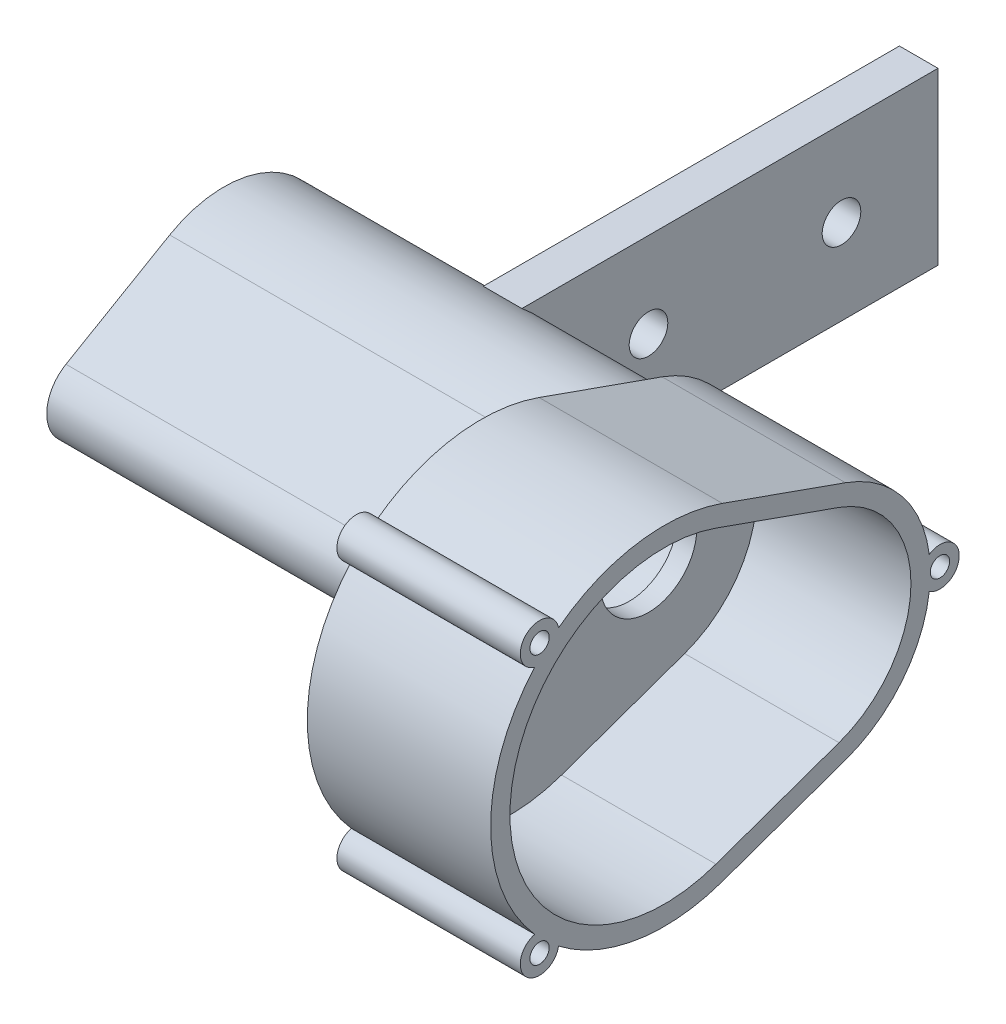
ISO-10303-21;
HEADER;
FILE_DESCRIPTION(('STEP AP214'),'2;1');
FILE_NAME('part.step','',(''),(''),'','','');
FILE_SCHEMA(('AUTOMOTIVE_DESIGN { 1 0 10303 214 1 1 1 1 }'));
ENDSEC;
DATA;
#1=APPLICATION_CONTEXT('core data for automotive mechanical design processes');
#2=APPLICATION_PROTOCOL_DEFINITION('international standard','automotive_design',2000,#1);
#3=PRODUCT_CONTEXT('',#1,'mechanical');
#4=PRODUCT('Part','Part','',(#3));
#5=PRODUCT_RELATED_PRODUCT_CATEGORY('part','',(#4));
#6=PRODUCT_DEFINITION_FORMATION('','',#4);
#7=PRODUCT_DEFINITION_CONTEXT('part definition',#1,'design');
#8=PRODUCT_DEFINITION('design','',#6,#7);
#9=PRODUCT_DEFINITION_SHAPE('','',#8);
#10=(LENGTH_UNIT() NAMED_UNIT(*) SI_UNIT(.MILLI.,.METRE.));
#11=(NAMED_UNIT(*) PLANE_ANGLE_UNIT() SI_UNIT($,.RADIAN.));
#12=(NAMED_UNIT(*) SI_UNIT($,.STERADIAN.) SOLID_ANGLE_UNIT());
#13=UNCERTAINTY_MEASURE_WITH_UNIT(LENGTH_MEASURE(1.E-05),#10,'distance_accuracy_value','');
#14=(GEOMETRIC_REPRESENTATION_CONTEXT(3) GLOBAL_UNCERTAINTY_ASSIGNED_CONTEXT((#13)) GLOBAL_UNIT_ASSIGNED_CONTEXT((#10,
#11,#12)) REPRESENTATION_CONTEXT('',''));
#15=CARTESIAN_POINT('',(0.,0.,0.));
#16=DIRECTION('',(0.,0.,1.));
#17=DIRECTION('',(1.,0.,0.));
#18=AXIS2_PLACEMENT_3D('',#15,#16,#17);
#19=CARTESIAN_POINT('',(22.,0.,0.));
#20=DIRECTION('',(-1.,0.,0.));
#21=DIRECTION('',(0.,0.,1.));
#22=AXIS2_PLACEMENT_3D('',#19,#20,#21);
#23=CYLINDRICAL_SURFACE('',#22,4.1);
#24=CARTESIAN_POINT('',(0.,0.,0.));
#25=DIRECTION('',(1.,0.,0.));
#26=DIRECTION('',(0.,0.,-1.));
#27=AXIS2_PLACEMENT_3D('',#24,#25,#26);
#28=CIRCLE('',#27,4.1);
#29=CARTESIAN_POINT('',(0.,0.,-4.1));
#30=VERTEX_POINT('',#29);
#31=EDGE_CURVE('E298',#30,#30,#28,.T.);
#32=ORIENTED_EDGE('',*,*,#31,.F.);
#33=EDGE_LOOP('',(#32));
#34=FACE_BOUND('',#33,.T.);
#35=CARTESIAN_POINT('',(21.,0.,0.));
#36=DIRECTION('',(1.,0.,0.));
#37=DIRECTION('',(0.,0.,-1.));
#38=AXIS2_PLACEMENT_3D('',#35,#36,#37);
#39=CIRCLE('',#38,4.1);
#40=CARTESIAN_POINT('',(21.,0.,-4.1));
#41=VERTEX_POINT('',#40);
#42=EDGE_CURVE('E248',#41,#41,#39,.F.);
#43=ORIENTED_EDGE('',*,*,#42,.F.);
#44=EDGE_LOOP('',(#43));
#45=FACE_BOUND('',#44,.T.);
#46=ADVANCED_FACE('F36',(#34,#45),#23,.F.);
#47=CARTESIAN_POINT('',(22.,0.,0.));
#48=DIRECTION('',(-1.,0.,0.));
#49=DIRECTION('',(0.,0.,1.));
#50=AXIS2_PLACEMENT_3D('',#47,#48,#49);
#51=CYLINDRICAL_SURFACE('',#50,5.6);
#52=DIRECTION('',(-1.,0.,0.));
#53=VECTOR('',#52,1.);
#54=CARTESIAN_POINT('',(22.,4.4192376757751,-3.43952589247558));
#55=LINE('',#54,#53);
#56=CARTESIAN_POINT('',(12.,4.41923767577509,-3.43952589247559));
#57=VERTEX_POINT('',#56);
#58=CARTESIAN_POINT('',(10.,4.41923767577509,-3.43952589247558));
#59=VERTEX_POINT('',#58);
#60=EDGE_CURVE('E326',#57,#59,#55,.T.);
#61=ORIENTED_EDGE('',*,*,#60,.T.);
#62=CARTESIAN_POINT('',(10.,0.,0.));
#63=DIRECTION('',(-1.,0.,0.));
#64=DIRECTION('',(0.,0.,1.));
#65=AXIS2_PLACEMENT_3D('',#62,#63,#64);
#66=CIRCLE('',#65,5.6);
#67=CARTESIAN_POINT('',(10.,-4.41923767577509,-3.43952589247559));
#68=VERTEX_POINT('',#67);
#69=EDGE_CURVE('E291',#59,#68,#66,.T.);
#70=ORIENTED_EDGE('',*,*,#69,.T.);
#71=DIRECTION('',(-1.,0.,0.));
#72=VECTOR('',#71,1.);
#73=CARTESIAN_POINT('',(22.,-4.41923767577509,-3.43952589247558));
#74=LINE('',#73,#72);
#75=CARTESIAN_POINT('',(12.,-4.41923767577509,-3.43952589247558));
#76=VERTEX_POINT('',#75);
#77=EDGE_CURVE('E323',#68,#76,#74,.F.);
#78=ORIENTED_EDGE('',*,*,#77,.T.);
#79=CARTESIAN_POINT('',(12.,0.,0.));
#80=DIRECTION('',(1.,0.,0.));
#81=DIRECTION('',(0.,0.,-1.));
#82=AXIS2_PLACEMENT_3D('',#79,#80,#81);
#83=CIRCLE('',#82,5.6);
#84=EDGE_CURVE('E281',#76,#57,#83,.T.);
#85=ORIENTED_EDGE('',*,*,#84,.T.);
#86=EDGE_LOOP('',(#61,#70,#78,#85));
#87=FACE_BOUND('',#86,.T.);
#88=DIRECTION('',(-1.,0.,0.));
#89=VECTOR('',#88,1.);
#90=CARTESIAN_POINT('',(22.,4.84523088082164,2.80779944289693));
#91=LINE('',#90,#89);
#92=CARTESIAN_POINT('',(20.5,4.84523088082164,2.80779944289693));
#93=VERTEX_POINT('',#92);
#94=CARTESIAN_POINT('',(0.,4.84523088082164,2.80779944289693));
#95=VERTEX_POINT('',#94);
#96=EDGE_CURVE('E317',#93,#95,#91,.T.);
#97=ORIENTED_EDGE('',*,*,#96,.F.);
#98=CARTESIAN_POINT('',(20.5,0.,0.));
#99=DIRECTION('',(1.,0.,0.));
#100=DIRECTION('',(0.,0.,-1.));
#101=AXIS2_PLACEMENT_3D('',#98,#99,#100);
#102=CIRCLE('',#101,5.6);
#103=CARTESIAN_POINT('',(20.5,-4.93426082210925,2.64822018333026));
#104=VERTEX_POINT('',#103);
#105=EDGE_CURVE('E332',#104,#93,#102,.T.);
#106=ORIENTED_EDGE('',*,*,#105,.F.);
#107=DIRECTION('',(-1.,0.,0.));
#108=VECTOR('',#107,1.);
#109=CARTESIAN_POINT('',(22.,-4.93426082210925,2.64822018333026));
#110=LINE('',#109,#108);
#111=CARTESIAN_POINT('',(0.,-4.93426082210925,2.64822018333026));
#112=VERTEX_POINT('',#111);
#113=EDGE_CURVE('E319',#104,#112,#110,.T.);
#114=ORIENTED_EDGE('',*,*,#113,.T.);
#115=CARTESIAN_POINT('',(0.,0.,0.));
#116=DIRECTION('',(1.,0.,0.));
#117=DIRECTION('',(0.,0.,-1.));
#118=AXIS2_PLACEMENT_3D('',#115,#116,#117);
#119=CIRCLE('',#118,5.6);
#120=EDGE_CURVE('E309',#112,#95,#119,.T.);
#121=ORIENTED_EDGE('',*,*,#120,.T.);
#122=EDGE_LOOP('',(#97,#106,#114,#121));
#123=FACE_BOUND('',#122,.T.);
#124=ADVANCED_FACE('F417',(#87,#123),#51,.T.);
#125=CARTESIAN_POINT('',(22.,0.,7.18));
#126=DIRECTION('',(-1.,0.,0.));
#127=DIRECTION('',(0.,0.,1.));
#128=AXIS2_PLACEMENT_3D('',#125,#126,#127);
#129=CYLINDRICAL_SURFACE('',#128,2.);
#130=DIRECTION('',(-1.,0.,0.));
#131=VECTOR('',#130,1.);
#132=CARTESIAN_POINT('',(22.,-1.73090695637433,8.1819785967649));
#133=LINE('',#132,#131);
#134=CARTESIAN_POINT('',(20.5,-1.73090695637433,8.1819785967649));
#135=VERTEX_POINT('',#134);
#136=CARTESIAN_POINT('',(0.,-1.73090695637433,8.1819785967649));
#137=VERTEX_POINT('',#136);
#138=EDGE_CURVE('E321',#135,#137,#133,.T.);
#139=ORIENTED_EDGE('',*,*,#138,.F.);
#140=CARTESIAN_POINT('',(20.5,0.,7.18));
#141=DIRECTION('',(1.,0.,0.));
#142=DIRECTION('',(0.,0.,-1.));
#143=AXIS2_PLACEMENT_3D('',#140,#141,#142);
#144=CIRCLE('',#143,2.);
#145=CARTESIAN_POINT('',(20.5,1.73043960029344,8.18278551532033));
#146=VERTEX_POINT('',#145);
#147=EDGE_CURVE('E337',#146,#135,#144,.T.);
#148=ORIENTED_EDGE('',*,*,#147,.F.);
#149=DIRECTION('',(-1.,0.,0.));
#150=VECTOR('',#149,1.);
#151=CARTESIAN_POINT('',(22.,1.73043960029344,8.18278551532033));
#152=LINE('',#151,#150);
#153=CARTESIAN_POINT('',(0.,1.73043960029344,8.18278551532033));
#154=VERTEX_POINT('',#153);
#155=EDGE_CURVE('E315',#146,#154,#152,.T.);
#156=ORIENTED_EDGE('',*,*,#155,.T.);
#157=CARTESIAN_POINT('',(0.,0.,7.18));
#158=DIRECTION('',(1.,0.,0.));
#159=DIRECTION('',(0.,0.,-1.));
#160=AXIS2_PLACEMENT_3D('',#157,#158,#159);
#161=CIRCLE('',#160,2.);
#162=EDGE_CURVE('E303',#154,#137,#161,.T.);
#163=ORIENTED_EDGE('',*,*,#162,.T.);
#164=EDGE_LOOP('',(#139,#148,#156,#163));
#165=FACE_BOUND('',#164,.T.);
#166=ADVANCED_FACE('F423',(#165),#129,.T.);
#167=CARTESIAN_POINT('',(22.,-4.93426082210925,2.64822018333026));
#168=DIRECTION('',(0.,0.865453478187166,-0.500989298382448));
#169=DIRECTION('',(0.,0.500989298382448,0.865453478187166));
#170=AXIS2_PLACEMENT_3D('',#167,#168,#169);
#171=PLANE('',#170);
#172=ORIENTED_EDGE('',*,*,#113,.F.);
#173=DIRECTION('',(0.,-0.500989298382448,-0.865453478187165));
#174=VECTOR('',#173,1.);
#175=CARTESIAN_POINT('',(20.5,-4.84403239965933,2.80408878629793));
#176=LINE('',#175,#174);
#177=EDGE_CURVE('E334',#135,#104,#176,.T.);
#178=ORIENTED_EDGE('',*,*,#177,.F.);
#179=ORIENTED_EDGE('',*,*,#138,.T.);
#180=DIRECTION('',(0.,-0.500989298382448,-0.865453478187165));
#181=VECTOR('',#180,1.);
#182=CARTESIAN_POINT('',(0.,-4.93426082210925,2.64822018333026));
#183=LINE('',#182,#181);
#184=EDGE_CURVE('E306',#137,#112,#183,.T.);
#185=ORIENTED_EDGE('',*,*,#184,.T.);
#186=EDGE_LOOP('',(#172,#178,#179,#185));
#187=FACE_BOUND('',#186,.T.);
#188=ADVANCED_FACE('F438',(#187),#171,.F.);
#189=CARTESIAN_POINT('',(22.,4.84523088082164,2.80779944289693));
#190=DIRECTION('',(0.,-0.865219800146722,-0.501392757660167));
#191=DIRECTION('',(0.,0.501392757660167,-0.865219800146722));
#192=AXIS2_PLACEMENT_3D('',#189,#190,#191);
#193=PLANE('',#192);
#194=ORIENTED_EDGE('',*,*,#155,.F.);
#195=DIRECTION('',(0.,-0.501392757660167,0.865219800146722));
#196=VECTOR('',#195,1.);
#197=CARTESIAN_POINT('',(20.5,4.84523088082164,2.80779944289693));
#198=LINE('',#197,#196);
#199=EDGE_CURVE('E329',#93,#146,#198,.T.);
#200=ORIENTED_EDGE('',*,*,#199,.F.);
#201=ORIENTED_EDGE('',*,*,#96,.T.);
#202=DIRECTION('',(0.,-0.501392757660167,0.865219800146722));
#203=VECTOR('',#202,1.);
#204=CARTESIAN_POINT('',(0.,4.84523088082164,2.80779944289693));
#205=LINE('',#204,#203);
#206=EDGE_CURVE('E312',#95,#154,#205,.T.);
#207=ORIENTED_EDGE('',*,*,#206,.T.);
#208=EDGE_LOOP('',(#194,#200,#201,#207));
#209=FACE_BOUND('',#208,.T.);
#210=ADVANCED_FACE('F435',(#209),#193,.F.);
#211=CARTESIAN_POINT('',(0.,0.,7.18));
#212=DIRECTION('',(1.,0.,0.));
#213=DIRECTION('',(0.,0.,-1.));
#214=AXIS2_PLACEMENT_3D('',#211,#212,#213);
#215=PLANE('',#214);
#216=ORIENTED_EDGE('',*,*,#162,.F.);
#217=ORIENTED_EDGE('',*,*,#206,.F.);
#218=ORIENTED_EDGE('',*,*,#120,.F.);
#219=ORIENTED_EDGE('',*,*,#184,.F.);
#220=EDGE_LOOP('',(#216,#217,#218,#219));
#221=FACE_BOUND('',#220,.T.);
#222=ORIENTED_EDGE('',*,*,#31,.T.);
#223=EDGE_LOOP('',(#222));
#224=FACE_BOUND('',#223,.T.);
#225=CARTESIAN_POINT('',(0.,0.,7.18));
#226=DIRECTION('',(1.,0.,0.));
#227=DIRECTION('',(0.,0.,-1.));
#228=AXIS2_PLACEMENT_3D('',#225,#226,#227);
#229=CIRCLE('',#228,0.749999999999998);
#230=CARTESIAN_POINT('',(0.,0.,6.43));
#231=VERTEX_POINT('',#230);
#232=EDGE_CURVE('E294',#231,#231,#229,.T.);
#233=ORIENTED_EDGE('',*,*,#232,.T.);
#234=EDGE_LOOP('',(#233));
#235=FACE_BOUND('',#234,.T.);
#236=ADVANCED_FACE('F432',(#221,#224,#235),#215,.F.);
#237=CARTESIAN_POINT('',(22.,0.,7.18));
#238=DIRECTION('',(-1.,0.,0.));
#239=DIRECTION('',(0.,0.,1.));
#240=AXIS2_PLACEMENT_3D('',#237,#238,#239);
#241=CYLINDRICAL_SURFACE('',#240,0.749999999999998);
#242=CARTESIAN_POINT('',(22.,0.,7.18));
#243=DIRECTION('',(1.,0.,0.));
#244=DIRECTION('',(0.,0.,-1.));
#245=AXIS2_PLACEMENT_3D('',#242,#243,#244);
#246=CIRCLE('',#245,0.749999999999998);
#247=CARTESIAN_POINT('',(22.,0.,6.43));
#248=VERTEX_POINT('',#247);
#249=EDGE_CURVE('E295',#248,#248,#246,.T.);
#250=ORIENTED_EDGE('',*,*,#249,.T.);
#251=EDGE_LOOP('',(#250));
#252=FACE_BOUND('',#251,.T.);
#253=ORIENTED_EDGE('',*,*,#232,.F.);
#254=EDGE_LOOP('',(#253));
#255=FACE_BOUND('',#254,.T.);
#256=ADVANCED_FACE('F430',(#252,#255),#241,.F.);
#257=CARTESIAN_POINT('',(12.,4.41923767577509,-25.));
#258=DIRECTION('',(0.,1.,0.));
#259=DIRECTION('',(-1.,0.,0.));
#260=AXIS2_PLACEMENT_3D('',#257,#258,#259);
#261=PLANE('',#260);
#262=ORIENTED_EDGE('',*,*,#60,.F.);
#263=DIRECTION('',(0.,0.,1.));
#264=VECTOR('',#263,1.);
#265=CARTESIAN_POINT('',(12.,4.41923767577509,-25.));
#266=LINE('',#265,#264);
#267=CARTESIAN_POINT('',(12.,4.41923767577509,-25.));
#268=VERTEX_POINT('',#267);
#269=EDGE_CURVE('E282',#268,#57,#266,.T.);
#270=ORIENTED_EDGE('',*,*,#269,.F.);
#271=DIRECTION('',(-1.,0.,0.));
#272=VECTOR('',#271,1.);
#273=CARTESIAN_POINT('',(12.,4.41923767577509,-25.));
#274=LINE('',#273,#272);
#275=CARTESIAN_POINT('',(10.,4.41923767577509,-25.));
#276=VERTEX_POINT('',#275);
#277=EDGE_CURVE('E274',#268,#276,#274,.T.);
#278=ORIENTED_EDGE('',*,*,#277,.T.);
#279=DIRECTION('',(0.,0.,1.));
#280=VECTOR('',#279,1.);
#281=CARTESIAN_POINT('',(10.,4.41923767577509,-25.));
#282=LINE('',#281,#280);
#283=EDGE_CURVE('E278',#276,#59,#282,.T.);
#284=ORIENTED_EDGE('',*,*,#283,.T.);
#285=EDGE_LOOP('',(#262,#270,#278,#284));
#286=FACE_BOUND('',#285,.T.);
#287=ADVANCED_FACE('F678',(#286),#261,.T.);
#288=CARTESIAN_POINT('',(12.,-4.41923767577509,-25.));
#289=DIRECTION('',(0.,-1.,0.));
#290=DIRECTION('',(0.,0.,-1.));
#291=AXIS2_PLACEMENT_3D('',#288,#289,#290);
#292=PLANE('',#291);
#293=ORIENTED_EDGE('',*,*,#77,.F.);
#294=DIRECTION('',(0.,0.,1.));
#295=VECTOR('',#294,1.);
#296=CARTESIAN_POINT('',(10.,-4.41923767577509,-25.));
#297=LINE('',#296,#295);
#298=CARTESIAN_POINT('',(10.,-4.41923767577509,-25.));
#299=VERTEX_POINT('',#298);
#300=EDGE_CURVE('E277',#299,#68,#297,.T.);
#301=ORIENTED_EDGE('',*,*,#300,.F.);
#302=DIRECTION('',(1.,0.,0.));
#303=VECTOR('',#302,1.);
#304=CARTESIAN_POINT('',(12.,-4.41923767577509,-25.));
#305=LINE('',#304,#303);
#306=CARTESIAN_POINT('',(12.,-4.41923767577509,-25.));
#307=VERTEX_POINT('',#306);
#308=EDGE_CURVE('E268',#299,#307,#305,.T.);
#309=ORIENTED_EDGE('',*,*,#308,.T.);
#310=DIRECTION('',(0.,0.,1.));
#311=VECTOR('',#310,1.);
#312=CARTESIAN_POINT('',(12.,-4.41923767577509,-25.));
#313=LINE('',#312,#311);
#314=EDGE_CURVE('E285',#307,#76,#313,.T.);
#315=ORIENTED_EDGE('',*,*,#314,.T.);
#316=EDGE_LOOP('',(#293,#301,#309,#315));
#317=FACE_BOUND('',#316,.T.);
#318=ADVANCED_FACE('F687',(#317),#292,.T.);
#319=CARTESIAN_POINT('',(10.,-4.41923767577509,-25.));
#320=DIRECTION('',(-1.,0.,0.));
#321=DIRECTION('',(0.,0.,1.));
#322=AXIS2_PLACEMENT_3D('',#319,#320,#321);
#323=PLANE('',#322);
#324=CARTESIAN_POINT('',(10.,0.,-20.));
#325=DIRECTION('',(-1.,0.,0.));
#326=DIRECTION('',(0.,0.,1.));
#327=AXIS2_PLACEMENT_3D('',#324,#325,#326);
#328=CIRCLE('',#327,1.);
#329=CARTESIAN_POINT('',(10.,0.,-19.));
#330=VERTEX_POINT('',#329);
#331=EDGE_CURVE('E262',#330,#330,#328,.T.);
#332=ORIENTED_EDGE('',*,*,#331,.F.);
#333=EDGE_LOOP('',(#332));
#334=FACE_BOUND('',#333,.T.);
#335=CARTESIAN_POINT('',(10.,0.,-10.));
#336=DIRECTION('',(-1.,0.,0.));
#337=DIRECTION('',(0.,0.,1.));
#338=AXIS2_PLACEMENT_3D('',#335,#336,#337);
#339=CIRCLE('',#338,1.);
#340=CARTESIAN_POINT('',(10.,0.,-9.));
#341=VERTEX_POINT('',#340);
#342=EDGE_CURVE('E257',#341,#341,#339,.T.);
#343=ORIENTED_EDGE('',*,*,#342,.F.);
#344=EDGE_LOOP('',(#343));
#345=FACE_BOUND('',#344,.T.);
#346=ORIENTED_EDGE('',*,*,#69,.F.);
#347=ORIENTED_EDGE('',*,*,#283,.F.);
#348=DIRECTION('',(0.,-1.,0.));
#349=VECTOR('',#348,1.);
#350=CARTESIAN_POINT('',(10.,-4.41923767577509,-25.));
#351=LINE('',#350,#349);
#352=EDGE_CURVE('E265',#276,#299,#351,.T.);
#353=ORIENTED_EDGE('',*,*,#352,.T.);
#354=ORIENTED_EDGE('',*,*,#300,.T.);
#355=EDGE_LOOP('',(#346,#347,#353,#354));
#356=FACE_BOUND('',#355,.T.);
#357=ADVANCED_FACE('F697',(#334,#345,#356),#323,.T.);
#358=CARTESIAN_POINT('',(12.,-4.41923767577509,-25.));
#359=DIRECTION('',(1.,0.,0.));
#360=DIRECTION('',(0.,0.,-1.));
#361=AXIS2_PLACEMENT_3D('',#358,#359,#360);
#362=PLANE('',#361);
#363=CARTESIAN_POINT('',(12.,0.,-20.));
#364=DIRECTION('',(1.,0.,0.));
#365=DIRECTION('',(0.,0.,-1.));
#366=AXIS2_PLACEMENT_3D('',#363,#364,#365);
#367=CIRCLE('',#366,1.);
#368=CARTESIAN_POINT('',(12.,0.,-21.));
#369=VERTEX_POINT('',#368);
#370=EDGE_CURVE('E254',#369,#369,#367,.T.);
#371=ORIENTED_EDGE('',*,*,#370,.F.);
#372=EDGE_LOOP('',(#371));
#373=FACE_BOUND('',#372,.T.);
#374=CARTESIAN_POINT('',(12.,0.,-10.));
#375=DIRECTION('',(1.,0.,0.));
#376=DIRECTION('',(0.,0.,-1.));
#377=AXIS2_PLACEMENT_3D('',#374,#375,#376);
#378=CIRCLE('',#377,1.);
#379=CARTESIAN_POINT('',(12.,0.,-11.));
#380=VERTEX_POINT('',#379);
#381=EDGE_CURVE('E252',#380,#380,#378,.T.);
#382=ORIENTED_EDGE('',*,*,#381,.F.);
#383=EDGE_LOOP('',(#382));
#384=FACE_BOUND('',#383,.T.);
#385=ORIENTED_EDGE('',*,*,#84,.F.);
#386=ORIENTED_EDGE('',*,*,#314,.F.);
#387=DIRECTION('',(0.,1.,0.));
#388=VECTOR('',#387,1.);
#389=CARTESIAN_POINT('',(12.,-4.41923767577509,-25.));
#390=LINE('',#389,#388);
#391=EDGE_CURVE('E271',#307,#268,#390,.T.);
#392=ORIENTED_EDGE('',*,*,#391,.T.);
#393=ORIENTED_EDGE('',*,*,#269,.T.);
#394=EDGE_LOOP('',(#385,#386,#392,#393));
#395=FACE_BOUND('',#394,.T.);
#396=ADVANCED_FACE('F707',(#373,#384,#395),#362,.T.);
#397=CARTESIAN_POINT('',(0.,0.,-25.));
#398=DIRECTION('',(0.,0.,1.));
#399=DIRECTION('',(1.,0.,0.));
#400=AXIS2_PLACEMENT_3D('',#397,#398,#399);
#401=PLANE('',#400);
#402=ORIENTED_EDGE('',*,*,#352,.F.);
#403=ORIENTED_EDGE('',*,*,#277,.F.);
#404=ORIENTED_EDGE('',*,*,#391,.F.);
#405=ORIENTED_EDGE('',*,*,#308,.F.);
#406=EDGE_LOOP('',(#402,#403,#404,#405));
#407=FACE_BOUND('',#406,.T.);
#408=ADVANCED_FACE('F716',(#407),#401,.F.);
#409=CARTESIAN_POINT('',(0.,0.,-10.));
#410=DIRECTION('',(1.,0.,0.));
#411=DIRECTION('',(0.,0.,-1.));
#412=AXIS2_PLACEMENT_3D('',#409,#410,#411);
#413=CYLINDRICAL_SURFACE('',#412,1.);
#414=ORIENTED_EDGE('',*,*,#342,.T.);
#415=EDGE_LOOP('',(#414));
#416=FACE_BOUND('',#415,.T.);
#417=ORIENTED_EDGE('',*,*,#381,.T.);
#418=EDGE_LOOP('',(#417));
#419=FACE_BOUND('',#418,.T.);
#420=ADVANCED_FACE('F726',(#416,#419),#413,.F.);
#421=CARTESIAN_POINT('',(0.,0.,-20.));
#422=DIRECTION('',(1.,0.,0.));
#423=DIRECTION('',(0.,0.,-1.));
#424=AXIS2_PLACEMENT_3D('',#421,#422,#423);
#425=CYLINDRICAL_SURFACE('',#424,1.);
#426=ORIENTED_EDGE('',*,*,#331,.T.);
#427=EDGE_LOOP('',(#426));
#428=FACE_BOUND('',#427,.T.);
#429=ORIENTED_EDGE('',*,*,#370,.T.);
#430=EDGE_LOOP('',(#429));
#431=FACE_BOUND('',#430,.T.);
#432=ADVANCED_FACE('F413',(#428,#431),#425,.F.);
#433=CARTESIAN_POINT('',(20.5,0.,7.18));
#434=DIRECTION('',(1.,0.,0.));
#435=DIRECTION('',(0.,0.,-1.));
#436=AXIS2_PLACEMENT_3D('',#433,#434,#435);
#437=CYLINDRICAL_SURFACE('',#436,8.);
#438=CARTESIAN_POINT('',(22.,0.,7.18));
#439=DIRECTION('',(1.,0.,0.));
#440=DIRECTION('',(0.,0.,-1.));
#441=AXIS2_PLACEMENT_3D('',#438,#439,#440);
#442=CIRCLE('',#441,8.);
#443=CARTESIAN_POINT('',(22.,7.53984200731082,4.50590529247911));
#444=VERTEX_POINT('',#443);
#445=CARTESIAN_POINT('',(22.,-7.53984200731082,4.50590529247911));
#446=VERTEX_POINT('',#445);
#447=EDGE_CURVE('E44',#444,#446,#442,.T.);
#448=ORIENTED_EDGE('',*,*,#447,.F.);
#449=DIRECTION('',(1.,0.,0.));
#450=VECTOR('',#449,1.);
#451=CARTESIAN_POINT('',(20.5,7.53984200731082,4.50590529247911));
#452=LINE('',#451,#450);
#453=CARTESIAN_POINT('',(30.,7.53984200731082,4.50590529247911));
#454=VERTEX_POINT('',#453);
#455=EDGE_CURVE('E181',#444,#454,#452,.T.);
#456=ORIENTED_EDGE('',*,*,#455,.T.);
#457=CARTESIAN_POINT('',(30.,0.,7.18));
#458=DIRECTION('',(1.,0.,0.));
#459=DIRECTION('',(0.,0.,-1.));
#460=AXIS2_PLACEMENT_3D('',#457,#458,#459);
#461=CIRCLE('',#460,8.);
#462=CARTESIAN_POINT('',(30.,-7.53984200731082,4.50590529247911));
#463=VERTEX_POINT('',#462);
#464=EDGE_CURVE('E186',#454,#463,#461,.T.);
#465=ORIENTED_EDGE('',*,*,#464,.T.);
#466=DIRECTION('',(1.,0.,0.));
#467=VECTOR('',#466,1.);
#468=CARTESIAN_POINT('',(20.5,-7.53984200731082,4.50590529247911));
#469=LINE('',#468,#467);
#470=EDGE_CURVE('E189',#446,#463,#469,.T.);
#471=ORIENTED_EDGE('',*,*,#470,.F.);
#472=EDGE_LOOP('',(#448,#456,#465,#471));
#473=FACE_BOUND('',#472,.T.);
#474=ADVANCED_FACE('F183',(#473),#437,.F.);
#475=CARTESIAN_POINT('',(20.5,-5.27788940511757,-1.87186629526462));
#476=DIRECTION('',(0.,-0.942480250913852,-0.334261838440111));
#477=DIRECTION('',(0.,0.334261838440111,-0.942480250913852));
#478=AXIS2_PLACEMENT_3D('',#475,#476,#477);
#479=PLANE('',#478);
#480=DIRECTION('',(0.,0.334261838440111,-0.942480250913852));
#481=VECTOR('',#480,1.);
#482=CARTESIAN_POINT('',(22.,-5.27788940511757,-1.87186629526462));
#483=LINE('',#482,#481);
#484=CARTESIAN_POINT('',(22.,-5.27788940511757,-1.87186629526462));
#485=VERTEX_POINT('',#484);
#486=EDGE_CURVE('E11',#446,#485,#483,.T.);
#487=ORIENTED_EDGE('',*,*,#486,.F.);
#488=ORIENTED_EDGE('',*,*,#470,.T.);
#489=DIRECTION('',(0.,0.334261838440111,-0.942480250913852));
#490=VECTOR('',#489,1.);
#491=CARTESIAN_POINT('',(30.,-5.27788940511757,-1.87186629526462));
#492=LINE('',#491,#490);
#493=CARTESIAN_POINT('',(30.,-5.27788940511758,-1.87186629526463));
#494=VERTEX_POINT('',#493);
#495=EDGE_CURVE('E204',#463,#494,#492,.T.);
#496=ORIENTED_EDGE('',*,*,#495,.T.);
#497=DIRECTION('',(-1.,0.,0.));
#498=VECTOR('',#497,1.);
#499=CARTESIAN_POINT('',(30.,-5.27788940511758,-1.87186629526463));
#500=LINE('',#499,#498);
#501=EDGE_CURVE('E244',#494,#485,#500,.T.);
#502=ORIENTED_EDGE('',*,*,#501,.T.);
#503=EDGE_LOOP('',(#487,#488,#496,#502));
#504=FACE_BOUND('',#503,.T.);
#505=ADVANCED_FACE('F405',(#504),#479,.F.);
#506=CARTESIAN_POINT('',(20.5,5.27788940511757,-1.87186629526463));
#507=DIRECTION('',(0.,-0.942480250913852,0.334261838440111));
#508=DIRECTION('',(0.,-0.334261838440111,-0.942480250913852));
#509=AXIS2_PLACEMENT_3D('',#506,#507,#508);
#510=PLANE('',#509);
#511=ORIENTED_EDGE('',*,*,#455,.F.);
#512=DIRECTION('',(0.,-0.334261838440111,-0.942480250913852));
#513=VECTOR('',#512,1.);
#514=CARTESIAN_POINT('',(22.,5.27788940511757,-1.87186629526463));
#515=LINE('',#514,#513);
#516=CARTESIAN_POINT('',(22.,5.27788940511757,-1.87186629526462));
#517=VERTEX_POINT('',#516);
#518=EDGE_CURVE('E54',#444,#517,#515,.T.);
#519=ORIENTED_EDGE('',*,*,#518,.T.);
#520=DIRECTION('',(-1.,0.,0.));
#521=VECTOR('',#520,1.);
#522=CARTESIAN_POINT('',(30.,5.27788940511758,-1.87186629526463));
#523=LINE('',#522,#521);
#524=CARTESIAN_POINT('',(30.,5.27788940511758,-1.87186629526463));
#525=VERTEX_POINT('',#524);
#526=EDGE_CURVE('E190',#525,#517,#523,.T.);
#527=ORIENTED_EDGE('',*,*,#526,.F.);
#528=DIRECTION('',(0.,-0.334261838440111,-0.942480250913852));
#529=VECTOR('',#528,1.);
#530=CARTESIAN_POINT('',(30.,5.27788940511757,-1.87186629526463));
#531=LINE('',#530,#529);
#532=EDGE_CURVE('E193',#454,#525,#531,.T.);
#533=ORIENTED_EDGE('',*,*,#532,.F.);
#534=EDGE_LOOP('',(#511,#519,#527,#533));
#535=FACE_BOUND('',#534,.T.);
#536=ADVANCED_FACE('F194',(#535),#510,.T.);
#537=CARTESIAN_POINT('',(30.,0.,0.));
#538=DIRECTION('',(-1.,0.,0.));
#539=DIRECTION('',(0.,0.,1.));
#540=AXIS2_PLACEMENT_3D('',#537,#538,#539);
#541=CYLINDRICAL_SURFACE('',#540,5.6);
#542=CARTESIAN_POINT('',(22.,0.,0.));
#543=DIRECTION('',(1.,0.,0.));
#544=DIRECTION('',(0.,0.,-1.));
#545=AXIS2_PLACEMENT_3D('',#542,#543,#544);
#546=CIRCLE('',#545,5.6);
#547=EDGE_CURVE('E245',#485,#517,#546,.T.);
#548=ORIENTED_EDGE('',*,*,#547,.F.);
#549=ORIENTED_EDGE('',*,*,#501,.F.);
#550=CARTESIAN_POINT('',(30.,0.,0.));
#551=DIRECTION('',(1.,0.,0.));
#552=DIRECTION('',(0.,0.,-1.));
#553=AXIS2_PLACEMENT_3D('',#550,#551,#552);
#554=CIRCLE('',#553,5.6);
#555=EDGE_CURVE('E199',#494,#525,#554,.T.);
#556=ORIENTED_EDGE('',*,*,#555,.T.);
#557=ORIENTED_EDGE('',*,*,#526,.T.);
#558=EDGE_LOOP('',(#548,#549,#556,#557));
#559=FACE_BOUND('',#558,.T.);
#560=ADVANCED_FACE('F401',(#559),#541,.F.);
#561=CARTESIAN_POINT('',(30.,0.,0.));
#562=DIRECTION('',(1.,0.,0.));
#563=DIRECTION('',(0.,0.,-1.));
#564=AXIS2_PLACEMENT_3D('',#561,#562,#563);
#565=PLANE('',#564);
#566=CARTESIAN_POINT('',(30.,0.,-7.1));
#567=DIRECTION('',(1.,0.,0.));
#568=DIRECTION('',(0.,0.,-1.));
#569=AXIS2_PLACEMENT_3D('',#566,#567,#568);
#570=CIRCLE('',#569,0.500000000000001);
#571=CARTESIAN_POINT('',(30.,0.,-7.6));
#572=VERTEX_POINT('',#571);
#573=EDGE_CURVE('E247',#572,#572,#570,.T.);
#574=ORIENTED_EDGE('',*,*,#573,.F.);
#575=EDGE_LOOP('',(#574));
#576=FACE_BOUND('',#575,.T.);
#577=CARTESIAN_POINT('',(30.,6.96119512186164,13.6446548612722));
#578=DIRECTION('',(1.,0.,0.));
#579=DIRECTION('',(0.,0.,-1.));
#580=AXIS2_PLACEMENT_3D('',#577,#578,#579);
#581=CIRCLE('',#580,0.500000000000001);
#582=CARTESIAN_POINT('',(30.,6.96119512186164,13.1446548612722));
#583=VERTEX_POINT('',#582);
#584=EDGE_CURVE('E208',#583,#583,#581,.T.);
#585=ORIENTED_EDGE('',*,*,#584,.F.);
#586=EDGE_LOOP('',(#585));
#587=FACE_BOUND('',#586,.T.);
#588=CARTESIAN_POINT('',(30.,-6.96119512186164,13.6446548612722));
#589=DIRECTION('',(1.,0.,0.));
#590=DIRECTION('',(0.,0.,-1.));
#591=AXIS2_PLACEMENT_3D('',#588,#589,#590);
#592=CIRCLE('',#591,0.500000000000001);
#593=CARTESIAN_POINT('',(30.,-6.96119512186164,13.1446548612722));
#594=VERTEX_POINT('',#593);
#595=EDGE_CURVE('E205',#594,#594,#592,.T.);
#596=ORIENTED_EDGE('',*,*,#595,.F.);
#597=EDGE_LOOP('',(#596));
#598=FACE_BOUND('',#597,.T.);
#599=ORIENTED_EDGE('',*,*,#464,.F.);
#600=ORIENTED_EDGE('',*,*,#532,.T.);
#601=ORIENTED_EDGE('',*,*,#555,.F.);
#602=ORIENTED_EDGE('',*,*,#495,.F.);
#603=EDGE_LOOP('',(#599,#600,#601,#602));
#604=FACE_BOUND('',#603,.T.);
#605=CARTESIAN_POINT('',(30.,0.,-7.1));
#606=DIRECTION('',(1.,0.,0.));
#607=DIRECTION('',(0.,0.,-1.));
#608=AXIS2_PLACEMENT_3D('',#605,#606,#607);
#609=CIRCLE('',#608,1.);
#610=CARTESIAN_POINT('',(30.,-0.833302750215766,-6.54718309859155));
#611=VERTEX_POINT('',#610);
#612=CARTESIAN_POINT('',(30.,0.833302750215765,-6.54718309859155));
#613=VERTEX_POINT('',#612);
#614=EDGE_CURVE('E214',#611,#613,#609,.T.);
#615=ORIENTED_EDGE('',*,*,#614,.T.);
#616=CARTESIAN_POINT('',(30.,0.,0.));
#617=DIRECTION('',(1.,0.,0.));
#618=DIRECTION('',(0.,0.,-1.));
#619=AXIS2_PLACEMENT_3D('',#616,#617,#618);
#620=CIRCLE('',#619,6.6);
#621=CARTESIAN_POINT('',(30.,6.22036965603142,-2.20612813370473));
#622=VERTEX_POINT('',#621);
#623=EDGE_CURVE('E217',#613,#622,#620,.T.);
#624=ORIENTED_EDGE('',*,*,#623,.T.);
#625=DIRECTION('',(0.,0.334261838440111,0.942480250913852));
#626=VECTOR('',#625,1.);
#627=CARTESIAN_POINT('',(30.,6.22036965603142,-2.20612813370473));
#628=LINE('',#627,#626);
#629=CARTESIAN_POINT('',(30.,8.48232225822467,4.171643454039));
#630=VERTEX_POINT('',#629);
#631=EDGE_CURVE('E220',#622,#630,#628,.T.);
#632=ORIENTED_EDGE('',*,*,#631,.T.);
#633=CARTESIAN_POINT('',(30.,0.,7.18));
#634=DIRECTION('',(1.,0.,0.));
#635=DIRECTION('',(0.,0.,-1.));
#636=AXIS2_PLACEMENT_3D('',#633,#634,#635);
#637=CIRCLE('',#636,9.);
#638=CARTESIAN_POINT('',(30.,7.13886604004173,12.6605649035787));
#639=VERTEX_POINT('',#638);
#640=EDGE_CURVE('E223',#630,#639,#637,.T.);
#641=ORIENTED_EDGE('',*,*,#640,.T.);
#642=CARTESIAN_POINT('',(30.,6.96119512186164,13.6446548612722));
#643=DIRECTION('',(1.,0.,0.));
#644=DIRECTION('',(0.,0.,-1.));
#645=AXIS2_PLACEMENT_3D('',#642,#643,#644);
#646=CIRCLE('',#645,0.999999999999998);
#647=CARTESIAN_POINT('',(30.,5.99291755549228,13.8945319399845));
#648=VERTEX_POINT('',#647);
#649=EDGE_CURVE('E226',#639,#648,#646,.T.);
#650=ORIENTED_EDGE('',*,*,#649,.T.);
#651=CARTESIAN_POINT('',(30.,0.,7.18));
#652=DIRECTION('',(1.,0.,0.));
#653=DIRECTION('',(0.,0.,-1.));
#654=AXIS2_PLACEMENT_3D('',#651,#652,#653);
#655=CIRCLE('',#654,9.);
#656=CARTESIAN_POINT('',(30.,-5.99291755549228,13.8945319399845));
#657=VERTEX_POINT('',#656);
#658=EDGE_CURVE('E229',#648,#657,#655,.T.);
#659=ORIENTED_EDGE('',*,*,#658,.T.);
#660=CARTESIAN_POINT('',(30.,-6.96119512186164,13.6446548612722));
#661=DIRECTION('',(1.,0.,0.));
#662=DIRECTION('',(0.,0.,-1.));
#663=AXIS2_PLACEMENT_3D('',#660,#661,#662);
#664=CIRCLE('',#663,0.999999999999997);
#665=CARTESIAN_POINT('',(30.,-7.13886604004173,12.6605649035787));
#666=VERTEX_POINT('',#665);
#667=EDGE_CURVE('E232',#657,#666,#664,.T.);
#668=ORIENTED_EDGE('',*,*,#667,.T.);
#669=CARTESIAN_POINT('',(30.,0.,7.18));
#670=DIRECTION('',(1.,0.,0.));
#671=DIRECTION('',(0.,0.,-1.));
#672=AXIS2_PLACEMENT_3D('',#669,#670,#671);
#673=CIRCLE('',#672,9.);
#674=CARTESIAN_POINT('',(30.,-8.48232225822467,4.171643454039));
#675=VERTEX_POINT('',#674);
#676=EDGE_CURVE('E235',#666,#675,#673,.T.);
#677=ORIENTED_EDGE('',*,*,#676,.T.);
#678=DIRECTION('',(0.,0.334261838440112,-0.942480250913852));
#679=VECTOR('',#678,1.);
#680=CARTESIAN_POINT('',(30.,-6.22036965603142,-2.20612813370474));
#681=LINE('',#680,#679);
#682=CARTESIAN_POINT('',(30.,-6.22036965603142,-2.20612813370474));
#683=VERTEX_POINT('',#682);
#684=EDGE_CURVE('E238',#675,#683,#681,.T.);
#685=ORIENTED_EDGE('',*,*,#684,.T.);
#686=CARTESIAN_POINT('',(30.,0.,0.));
#687=DIRECTION('',(1.,0.,0.));
#688=DIRECTION('',(0.,0.,-1.));
#689=AXIS2_PLACEMENT_3D('',#686,#687,#688);
#690=CIRCLE('',#689,6.6);
#691=EDGE_CURVE('E241',#683,#611,#690,.T.);
#692=ORIENTED_EDGE('',*,*,#691,.T.);
#693=EDGE_LOOP('',(#615,#624,#632,#641,#650,#659,#668,#677,#685,#692));
#694=FACE_BOUND('',#693,.T.);
#695=ADVANCED_FACE('F201',(#576,#587,#598,#604,#694),#565,.T.);
#696=CARTESIAN_POINT('',(20.5,0.,0.));
#697=DIRECTION('',(1.,0.,0.));
#698=DIRECTION('',(0.,0.,-1.));
#699=AXIS2_PLACEMENT_3D('',#696,#697,#698);
#700=CYLINDRICAL_SURFACE('',#699,6.6);
#701=DIRECTION('',(1.,0.,0.));
#702=VECTOR('',#701,1.);
#703=CARTESIAN_POINT('',(20.5,6.22036965603142,-2.20612813370473));
#704=LINE('',#703,#702);
#705=CARTESIAN_POINT('',(20.5,6.22036965603142,-2.20612813370473));
#706=VERTEX_POINT('',#705);
#707=EDGE_CURVE('E396',#706,#622,#704,.T.);
#708=ORIENTED_EDGE('',*,*,#707,.T.);
#709=ORIENTED_EDGE('',*,*,#623,.F.);
#710=DIRECTION('',(1.,0.,0.));
#711=VECTOR('',#710,1.);
#712=CARTESIAN_POINT('',(20.5,0.833302750215765,-6.54718309859155));
#713=LINE('',#712,#711);
#714=CARTESIAN_POINT('',(20.5,0.833302750215765,-6.54718309859155));
#715=VERTEX_POINT('',#714);
#716=EDGE_CURVE('E379',#715,#613,#713,.T.);
#717=ORIENTED_EDGE('',*,*,#716,.F.);
#718=CARTESIAN_POINT('',(20.5,0.,0.));
#719=DIRECTION('',(1.,0.,0.));
#720=DIRECTION('',(0.,0.,-1.));
#721=AXIS2_PLACEMENT_3D('',#718,#719,#720);
#722=CIRCLE('',#721,6.6);
#723=EDGE_CURVE('E352',#715,#706,#722,.T.);
#724=ORIENTED_EDGE('',*,*,#723,.T.);
#725=EDGE_LOOP('',(#708,#709,#717,#724));
#726=FACE_BOUND('',#725,.T.);
#727=ADVANCED_FACE('F486',(#726),#700,.T.);
#728=CARTESIAN_POINT('',(20.5,6.22036965603142,-2.20612813370473));
#729=DIRECTION('',(0.,0.942480250913852,-0.334261838440111));
#730=DIRECTION('',(0.,0.334261838440111,0.942480250913852));
#731=AXIS2_PLACEMENT_3D('',#728,#729,#730);
#732=PLANE('',#731);
#733=DIRECTION('',(1.,0.,0.));
#734=VECTOR('',#733,1.);
#735=CARTESIAN_POINT('',(20.5,8.48232225822467,4.171643454039));
#736=LINE('',#735,#734);
#737=CARTESIAN_POINT('',(20.5,8.48232225822467,4.171643454039));
#738=VERTEX_POINT('',#737);
#739=EDGE_CURVE('E394',#738,#630,#736,.T.);
#740=ORIENTED_EDGE('',*,*,#739,.T.);
#741=ORIENTED_EDGE('',*,*,#631,.F.);
#742=ORIENTED_EDGE('',*,*,#707,.F.);
#743=DIRECTION('',(0.,0.334261838440111,0.942480250913852));
#744=VECTOR('',#743,1.);
#745=CARTESIAN_POINT('',(20.5,6.22036965603142,-2.20612813370473));
#746=LINE('',#745,#744);
#747=EDGE_CURVE('E355',#706,#738,#746,.T.);
#748=ORIENTED_EDGE('',*,*,#747,.T.);
#749=EDGE_LOOP('',(#740,#741,#742,#748));
#750=FACE_BOUND('',#749,.T.);
#751=ADVANCED_FACE('F482',(#750),#732,.T.);
#752=CARTESIAN_POINT('',(20.5,0.,7.18));
#753=DIRECTION('',(1.,0.,0.));
#754=DIRECTION('',(0.,0.,-1.));
#755=AXIS2_PLACEMENT_3D('',#752,#753,#754);
#756=CYLINDRICAL_SURFACE('',#755,9.);
#757=DIRECTION('',(1.,0.,0.));
#758=VECTOR('',#757,1.);
#759=CARTESIAN_POINT('',(20.5,7.13886604004173,12.6605649035787));
#760=LINE('',#759,#758);
#761=CARTESIAN_POINT('',(20.5,7.13886604004173,12.6605649035787));
#762=VERTEX_POINT('',#761);
#763=EDGE_CURVE('E392',#762,#639,#760,.T.);
#764=ORIENTED_EDGE('',*,*,#763,.T.);
#765=ORIENTED_EDGE('',*,*,#640,.F.);
#766=ORIENTED_EDGE('',*,*,#739,.F.);
#767=CARTESIAN_POINT('',(20.5,0.,7.18));
#768=DIRECTION('',(1.,0.,0.));
#769=DIRECTION('',(0.,0.,-1.));
#770=AXIS2_PLACEMENT_3D('',#767,#768,#769);
#771=CIRCLE('',#770,9.);
#772=EDGE_CURVE('E358',#738,#762,#771,.T.);
#773=ORIENTED_EDGE('',*,*,#772,.T.);
#774=EDGE_LOOP('',(#764,#765,#766,#773));
#775=FACE_BOUND('',#774,.T.);
#776=ADVANCED_FACE('F478',(#775),#756,.T.);
#777=CARTESIAN_POINT('',(20.5,6.96119512186164,13.6446548612722));
#778=DIRECTION('',(1.,0.,0.));
#779=DIRECTION('',(0.,0.,-1.));
#780=AXIS2_PLACEMENT_3D('',#777,#778,#779);
#781=CYLINDRICAL_SURFACE('',#780,0.999999999999998);
#782=DIRECTION('',(1.,0.,0.));
#783=VECTOR('',#782,1.);
#784=CARTESIAN_POINT('',(20.5,5.99291755549228,13.8945319399845));
#785=LINE('',#784,#783);
#786=CARTESIAN_POINT('',(20.5,5.99291755549228,13.8945319399845));
#787=VERTEX_POINT('',#786);
#788=EDGE_CURVE('E390',#787,#648,#785,.T.);
#789=ORIENTED_EDGE('',*,*,#788,.T.);
#790=ORIENTED_EDGE('',*,*,#649,.F.);
#791=ORIENTED_EDGE('',*,*,#763,.F.);
#792=CARTESIAN_POINT('',(20.5,6.96119512186164,13.6446548612722));
#793=DIRECTION('',(1.,0.,0.));
#794=DIRECTION('',(0.,0.,-1.));
#795=AXIS2_PLACEMENT_3D('',#792,#793,#794);
#796=CIRCLE('',#795,0.999999999999998);
#797=EDGE_CURVE('E361',#762,#787,#796,.T.);
#798=ORIENTED_EDGE('',*,*,#797,.T.);
#799=EDGE_LOOP('',(#789,#790,#791,#798));
#800=FACE_BOUND('',#799,.T.);
#801=ADVANCED_FACE('F474',(#800),#781,.T.);
#802=CARTESIAN_POINT('',(20.5,0.,7.18));
#803=DIRECTION('',(1.,0.,0.));
#804=DIRECTION('',(0.,0.,-1.));
#805=AXIS2_PLACEMENT_3D('',#802,#803,#804);
#806=CYLINDRICAL_SURFACE('',#805,9.);
#807=DIRECTION('',(1.,0.,0.));
#808=VECTOR('',#807,1.);
#809=CARTESIAN_POINT('',(20.5,-5.99291755549228,13.8945319399845));
#810=LINE('',#809,#808);
#811=CARTESIAN_POINT('',(20.5,-5.99291755549228,13.8945319399845));
#812=VERTEX_POINT('',#811);
#813=EDGE_CURVE('E388',#812,#657,#810,.T.);
#814=ORIENTED_EDGE('',*,*,#813,.T.);
#815=ORIENTED_EDGE('',*,*,#658,.F.);
#816=ORIENTED_EDGE('',*,*,#788,.F.);
#817=CARTESIAN_POINT('',(20.5,0.,7.18));
#818=DIRECTION('',(1.,0.,0.));
#819=DIRECTION('',(0.,0.,-1.));
#820=AXIS2_PLACEMENT_3D('',#817,#818,#819);
#821=CIRCLE('',#820,9.);
#822=EDGE_CURVE('E364',#787,#812,#821,.T.);
#823=ORIENTED_EDGE('',*,*,#822,.T.);
#824=EDGE_LOOP('',(#814,#815,#816,#823));
#825=FACE_BOUND('',#824,.T.);
#826=ADVANCED_FACE('F470',(#825),#806,.T.);
#827=CARTESIAN_POINT('',(20.5,-6.96119512186164,13.6446548612722));
#828=DIRECTION('',(1.,0.,0.));
#829=DIRECTION('',(0.,0.,-1.));
#830=AXIS2_PLACEMENT_3D('',#827,#828,#829);
#831=CYLINDRICAL_SURFACE('',#830,0.999999999999997);
#832=DIRECTION('',(1.,0.,0.));
#833=VECTOR('',#832,1.);
#834=CARTESIAN_POINT('',(20.5,-7.13886604004173,12.6605649035787));
#835=LINE('',#834,#833);
#836=CARTESIAN_POINT('',(20.5,-7.13886604004173,12.6605649035787));
#837=VERTEX_POINT('',#836);
#838=EDGE_CURVE('E386',#837,#666,#835,.T.);
#839=ORIENTED_EDGE('',*,*,#838,.T.);
#840=ORIENTED_EDGE('',*,*,#667,.F.);
#841=ORIENTED_EDGE('',*,*,#813,.F.);
#842=CARTESIAN_POINT('',(20.5,-6.96119512186164,13.6446548612722));
#843=DIRECTION('',(1.,0.,0.));
#844=DIRECTION('',(0.,0.,-1.));
#845=AXIS2_PLACEMENT_3D('',#842,#843,#844);
#846=CIRCLE('',#845,0.999999999999997);
#847=EDGE_CURVE('E367',#812,#837,#846,.T.);
#848=ORIENTED_EDGE('',*,*,#847,.T.);
#849=EDGE_LOOP('',(#839,#840,#841,#848));
#850=FACE_BOUND('',#849,.T.);
#851=ADVANCED_FACE('F466',(#850),#831,.T.);
#852=CARTESIAN_POINT('',(20.5,0.,7.18));
#853=DIRECTION('',(1.,0.,0.));
#854=DIRECTION('',(0.,0.,-1.));
#855=AXIS2_PLACEMENT_3D('',#852,#853,#854);
#856=CYLINDRICAL_SURFACE('',#855,9.);
#857=DIRECTION('',(1.,0.,0.));
#858=VECTOR('',#857,1.);
#859=CARTESIAN_POINT('',(20.5,-8.48232225822467,4.171643454039));
#860=LINE('',#859,#858);
#861=CARTESIAN_POINT('',(20.5,-8.48232225822467,4.171643454039));
#862=VERTEX_POINT('',#861);
#863=EDGE_CURVE('E384',#862,#675,#860,.T.);
#864=ORIENTED_EDGE('',*,*,#863,.T.);
#865=ORIENTED_EDGE('',*,*,#676,.F.);
#866=ORIENTED_EDGE('',*,*,#838,.F.);
#867=CARTESIAN_POINT('',(20.5,0.,7.18));
#868=DIRECTION('',(1.,0.,0.));
#869=DIRECTION('',(0.,0.,-1.));
#870=AXIS2_PLACEMENT_3D('',#867,#868,#869);
#871=CIRCLE('',#870,9.);
#872=EDGE_CURVE('E370',#837,#862,#871,.T.);
#873=ORIENTED_EDGE('',*,*,#872,.T.);
#874=EDGE_LOOP('',(#864,#865,#866,#873));
#875=FACE_BOUND('',#874,.T.);
#876=ADVANCED_FACE('F462',(#875),#856,.T.);
#877=CARTESIAN_POINT('',(20.5,-6.22036965603142,-2.20612813370474));
#878=DIRECTION('',(0.,-0.942480250913852,-0.334261838440112));
#879=DIRECTION('',(0.,0.334261838440112,-0.942480250913852));
#880=AXIS2_PLACEMENT_3D('',#877,#878,#879);
#881=PLANE('',#880);
#882=DIRECTION('',(1.,0.,0.));
#883=VECTOR('',#882,1.);
#884=CARTESIAN_POINT('',(20.5,-6.22036965603142,-2.20612813370474));
#885=LINE('',#884,#883);
#886=CARTESIAN_POINT('',(20.5,-6.22036965603142,-2.20612813370474));
#887=VERTEX_POINT('',#886);
#888=EDGE_CURVE('E382',#887,#683,#885,.T.);
#889=ORIENTED_EDGE('',*,*,#888,.T.);
#890=ORIENTED_EDGE('',*,*,#684,.F.);
#891=ORIENTED_EDGE('',*,*,#863,.F.);
#892=DIRECTION('',(0.,0.334261838440112,-0.942480250913852));
#893=VECTOR('',#892,1.);
#894=CARTESIAN_POINT('',(20.5,-6.22036965603142,-2.20612813370474));
#895=LINE('',#894,#893);
#896=EDGE_CURVE('E373',#862,#887,#895,.T.);
#897=ORIENTED_EDGE('',*,*,#896,.T.);
#898=EDGE_LOOP('',(#889,#890,#891,#897));
#899=FACE_BOUND('',#898,.T.);
#900=ADVANCED_FACE('F458',(#899),#881,.T.);
#901=CARTESIAN_POINT('',(20.5,0.,0.));
#902=DIRECTION('',(1.,0.,0.));
#903=DIRECTION('',(0.,0.,-1.));
#904=AXIS2_PLACEMENT_3D('',#901,#902,#903);
#905=CYLINDRICAL_SURFACE('',#904,6.6);
#906=DIRECTION('',(1.,0.,0.));
#907=VECTOR('',#906,1.);
#908=CARTESIAN_POINT('',(20.5,-0.833302750215766,-6.54718309859155));
#909=LINE('',#908,#907);
#910=CARTESIAN_POINT('',(20.5,-0.833302750215766,-6.54718309859155));
#911=VERTEX_POINT('',#910);
#912=EDGE_CURVE('E380',#911,#611,#909,.T.);
#913=ORIENTED_EDGE('',*,*,#912,.T.);
#914=ORIENTED_EDGE('',*,*,#691,.F.);
#915=ORIENTED_EDGE('',*,*,#888,.F.);
#916=CARTESIAN_POINT('',(20.5,0.,0.));
#917=DIRECTION('',(1.,0.,0.));
#918=DIRECTION('',(0.,0.,-1.));
#919=AXIS2_PLACEMENT_3D('',#916,#917,#918);
#920=CIRCLE('',#919,6.6);
#921=EDGE_CURVE('E376',#887,#911,#920,.T.);
#922=ORIENTED_EDGE('',*,*,#921,.T.);
#923=EDGE_LOOP('',(#913,#914,#915,#922));
#924=FACE_BOUND('',#923,.T.);
#925=ADVANCED_FACE('F454',(#924),#905,.T.);
#926=CARTESIAN_POINT('',(20.5,0.,-7.1));
#927=DIRECTION('',(1.,0.,0.));
#928=DIRECTION('',(0.,0.,-1.));
#929=AXIS2_PLACEMENT_3D('',#926,#927,#928);
#930=CYLINDRICAL_SURFACE('',#929,1.);
#931=ORIENTED_EDGE('',*,*,#716,.T.);
#932=ORIENTED_EDGE('',*,*,#614,.F.);
#933=ORIENTED_EDGE('',*,*,#912,.F.);
#934=CARTESIAN_POINT('',(20.5,0.,-7.1));
#935=DIRECTION('',(1.,0.,0.));
#936=DIRECTION('',(0.,0.,-1.));
#937=AXIS2_PLACEMENT_3D('',#934,#935,#936);
#938=CIRCLE('',#937,1.);
#939=EDGE_CURVE('E349',#911,#715,#938,.T.);
#940=ORIENTED_EDGE('',*,*,#939,.T.);
#941=EDGE_LOOP('',(#931,#932,#933,#940));
#942=FACE_BOUND('',#941,.T.);
#943=ADVANCED_FACE('F457',(#942),#930,.T.);
#944=CARTESIAN_POINT('',(20.5,-6.96119512186164,13.6446548612722));
#945=DIRECTION('',(1.,0.,0.));
#946=DIRECTION('',(0.,0.,-1.));
#947=AXIS2_PLACEMENT_3D('',#944,#945,#946);
#948=CYLINDRICAL_SURFACE('',#947,0.500000000000001);
#949=CARTESIAN_POINT('',(20.5,-6.96119512186164,13.6446548612722));
#950=DIRECTION('',(1.,0.,0.));
#951=DIRECTION('',(0.,0.,-1.));
#952=AXIS2_PLACEMENT_3D('',#949,#950,#951);
#953=CIRCLE('',#952,0.500000000000001);
#954=CARTESIAN_POINT('',(20.5,-6.96119512186164,13.1446548612722));
#955=VERTEX_POINT('',#954);
#956=EDGE_CURVE('E346',#955,#955,#953,.T.);
#957=ORIENTED_EDGE('',*,*,#956,.F.);
#958=EDGE_LOOP('',(#957));
#959=FACE_BOUND('',#958,.T.);
#960=ORIENTED_EDGE('',*,*,#595,.T.);
#961=EDGE_LOOP('',(#960));
#962=FACE_BOUND('',#961,.T.);
#963=ADVANCED_FACE('F493',(#959,#962),#948,.F.);
#964=CARTESIAN_POINT('',(20.5,6.96119512186164,13.6446548612722));
#965=DIRECTION('',(1.,0.,0.));
#966=DIRECTION('',(0.,0.,-1.));
#967=AXIS2_PLACEMENT_3D('',#964,#965,#966);
#968=CYLINDRICAL_SURFACE('',#967,0.500000000000001);
#969=CARTESIAN_POINT('',(20.5,6.96119512186164,13.6446548612722));
#970=DIRECTION('',(1.,0.,0.));
#971=DIRECTION('',(0.,0.,-1.));
#972=AXIS2_PLACEMENT_3D('',#969,#970,#971);
#973=CIRCLE('',#972,0.500000000000001);
#974=CARTESIAN_POINT('',(20.5,6.96119512186164,13.1446548612722));
#975=VERTEX_POINT('',#974);
#976=EDGE_CURVE('E343',#975,#975,#973,.T.);
#977=ORIENTED_EDGE('',*,*,#976,.F.);
#978=EDGE_LOOP('',(#977));
#979=FACE_BOUND('',#978,.T.);
#980=ORIENTED_EDGE('',*,*,#584,.T.);
#981=EDGE_LOOP('',(#980));
#982=FACE_BOUND('',#981,.T.);
#983=ADVANCED_FACE('F496',(#979,#982),#968,.F.);
#984=CARTESIAN_POINT('',(20.5,0.,-7.1));
#985=DIRECTION('',(1.,0.,0.));
#986=DIRECTION('',(0.,0.,-1.));
#987=AXIS2_PLACEMENT_3D('',#984,#985,#986);
#988=CYLINDRICAL_SURFACE('',#987,0.500000000000001);
#989=CARTESIAN_POINT('',(20.5,0.,-7.1));
#990=DIRECTION('',(1.,0.,0.));
#991=DIRECTION('',(0.,0.,-1.));
#992=AXIS2_PLACEMENT_3D('',#989,#990,#991);
#993=CIRCLE('',#992,0.500000000000001);
#994=CARTESIAN_POINT('',(20.5,0.,-7.6));
#995=VERTEX_POINT('',#994);
#996=EDGE_CURVE('E340',#995,#995,#993,.T.);
#997=ORIENTED_EDGE('',*,*,#996,.F.);
#998=EDGE_LOOP('',(#997));
#999=FACE_BOUND('',#998,.T.);
#1000=ORIENTED_EDGE('',*,*,#573,.T.);
#1001=EDGE_LOOP('',(#1000));
#1002=FACE_BOUND('',#1001,.T.);
#1003=ADVANCED_FACE('F38',(#999,#1002),#988,.F.);
#1004=CARTESIAN_POINT('',(20.5,0.,0.));
#1005=DIRECTION('',(1.,0.,0.));
#1006=DIRECTION('',(0.,0.,-1.));
#1007=AXIS2_PLACEMENT_3D('',#1004,#1005,#1006);
#1008=PLANE('',#1007);
#1009=ORIENTED_EDGE('',*,*,#105,.T.);
#1010=ORIENTED_EDGE('',*,*,#199,.T.);
#1011=ORIENTED_EDGE('',*,*,#147,.T.);
#1012=ORIENTED_EDGE('',*,*,#177,.T.);
#1013=EDGE_LOOP('',(#1009,#1010,#1011,#1012));
#1014=FACE_BOUND('',#1013,.T.);
#1015=ORIENTED_EDGE('',*,*,#996,.T.);
#1016=EDGE_LOOP('',(#1015));
#1017=FACE_BOUND('',#1016,.T.);
#1018=ORIENTED_EDGE('',*,*,#976,.T.);
#1019=EDGE_LOOP('',(#1018));
#1020=FACE_BOUND('',#1019,.T.);
#1021=ORIENTED_EDGE('',*,*,#956,.T.);
#1022=EDGE_LOOP('',(#1021));
#1023=FACE_BOUND('',#1022,.T.);
#1024=ORIENTED_EDGE('',*,*,#939,.F.);
#1025=ORIENTED_EDGE('',*,*,#921,.F.);
#1026=ORIENTED_EDGE('',*,*,#896,.F.);
#1027=ORIENTED_EDGE('',*,*,#872,.F.);
#1028=ORIENTED_EDGE('',*,*,#847,.F.);
#1029=ORIENTED_EDGE('',*,*,#822,.F.);
#1030=ORIENTED_EDGE('',*,*,#797,.F.);
#1031=ORIENTED_EDGE('',*,*,#772,.F.);
#1032=ORIENTED_EDGE('',*,*,#747,.F.);
#1033=ORIENTED_EDGE('',*,*,#723,.F.);
#1034=EDGE_LOOP('',(#1024,#1025,#1026,#1027,#1028,#1029,#1030,#1031,#1032,#1033));
#1035=FACE_BOUND('',#1034,.T.);
#1036=ADVANCED_FACE('F447',(#1014,#1017,#1020,#1023,#1035),#1008,.F.);
#1037=CARTESIAN_POINT('',(22.,0.,0.));
#1038=DIRECTION('',(1.,0.,0.));
#1039=DIRECTION('',(0.,0.,-1.));
#1040=AXIS2_PLACEMENT_3D('',#1037,#1038,#1039);
#1041=PLANE('',#1040);
#1042=ORIENTED_EDGE('',*,*,#486,.T.);
#1043=ORIENTED_EDGE('',*,*,#547,.T.);
#1044=ORIENTED_EDGE('',*,*,#518,.F.);
#1045=ORIENTED_EDGE('',*,*,#447,.T.);
#1046=EDGE_LOOP('',(#1042,#1043,#1044,#1045));
#1047=FACE_BOUND('',#1046,.T.);
#1048=ORIENTED_EDGE('',*,*,#249,.F.);
#1049=EDGE_LOOP('',(#1048));
#1050=FACE_BOUND('',#1049,.T.);
#1051=CARTESIAN_POINT('',(22.,0.,0.));
#1052=DIRECTION('',(1.,0.,0.));
#1053=DIRECTION('',(0.,0.,-1.));
#1054=AXIS2_PLACEMENT_3D('',#1051,#1052,#1053);
#1055=CIRCLE('',#1054,2.5);
#1056=CARTESIAN_POINT('',(22.,0.,-2.5));
#1057=VERTEX_POINT('',#1056);
#1058=EDGE_CURVE('E512',#1057,#1057,#1055,.T.);
#1059=ORIENTED_EDGE('',*,*,#1058,.F.);
#1060=EDGE_LOOP('',(#1059));
#1061=FACE_BOUND('',#1060,.T.);
#1062=ADVANCED_FACE('F402',(#1047,#1050,#1061),#1041,.T.);
#1063=CARTESIAN_POINT('',(21.,0.,0.));
#1064=DIRECTION('',(1.,0.,0.));
#1065=DIRECTION('',(0.,0.,-1.));
#1066=AXIS2_PLACEMENT_3D('',#1063,#1064,#1065);
#1067=CYLINDRICAL_SURFACE('',#1066,2.5);
#1068=CARTESIAN_POINT('',(21.,0.,0.));
#1069=DIRECTION('',(1.,0.,0.));
#1070=DIRECTION('',(0.,0.,-1.));
#1071=AXIS2_PLACEMENT_3D('',#1068,#1069,#1070);
#1072=CIRCLE('',#1071,2.5);
#1073=CARTESIAN_POINT('',(21.,0.,-2.5));
#1074=VERTEX_POINT('',#1073);
#1075=EDGE_CURVE('E515',#1074,#1074,#1072,.T.);
#1076=ORIENTED_EDGE('',*,*,#1075,.F.);
#1077=EDGE_LOOP('',(#1076));
#1078=FACE_BOUND('',#1077,.T.);
#1079=ORIENTED_EDGE('',*,*,#1058,.T.);
#1080=EDGE_LOOP('',(#1079));
#1081=FACE_BOUND('',#1080,.T.);
#1082=ADVANCED_FACE('F453',(#1078,#1081),#1067,.F.);
#1083=CARTESIAN_POINT('',(21.,0.,0.));
#1084=DIRECTION('',(1.,0.,0.));
#1085=DIRECTION('',(0.,0.,-1.));
#1086=AXIS2_PLACEMENT_3D('',#1083,#1084,#1085);
#1087=PLANE('',#1086);
#1088=ORIENTED_EDGE('',*,*,#1075,.T.);
#1089=EDGE_LOOP('',(#1088));
#1090=FACE_BOUND('',#1089,.T.);
#1091=ORIENTED_EDGE('',*,*,#42,.T.);
#1092=EDGE_LOOP('',(#1091));
#1093=FACE_BOUND('',#1092,.T.);
#1094=ADVANCED_FACE('F521',(#1090,#1093),#1087,.F.);
#1095=CLOSED_SHELL('',(#46,#124,#166,#188,#210,#236,#256,#287,#318,#357,#396,#408,#420,#432,
#474,#505,#536,#560,#695,#727,#751,#776,#801,#826,#851,#876,#900,#925,#943,#963,#983,#1003,
#1036,#1062,#1082,#1094));
#1096=MANIFOLD_SOLID_BREP('B2',#1095);
#1097=ADVANCED_BREP_SHAPE_REPRESENTATION('',(#18,#1096),#14);
#1098=SHAPE_DEFINITION_REPRESENTATION(#9,#1097);
ENDSEC;
END-ISO-10303-21;
